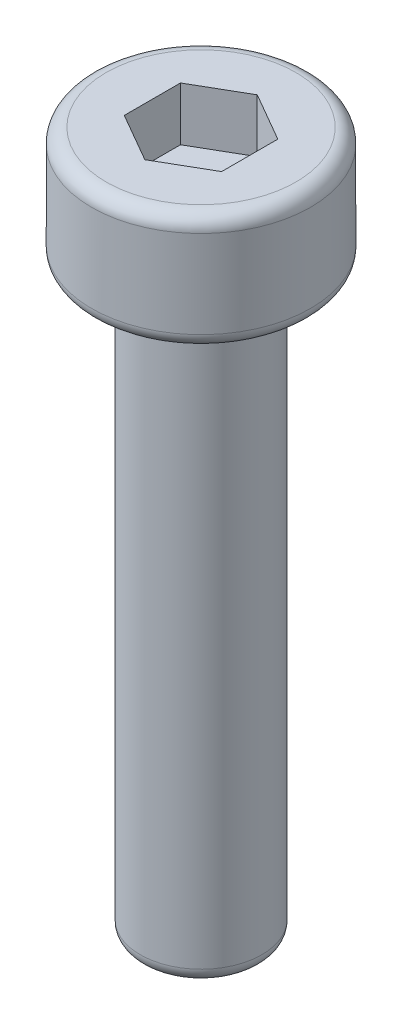
ISO-10303-21;
HEADER;
FILE_DESCRIPTION(('STEP AP214'),'2;1');
FILE_NAME('part.step','',(''),(''),'','','');
FILE_SCHEMA(('AUTOMOTIVE_DESIGN { 1 0 10303 214 1 1 1 1 }'));
ENDSEC;
DATA;
#1=APPLICATION_CONTEXT('core data for automotive mechanical design processes');
#2=APPLICATION_PROTOCOL_DEFINITION('international standard','automotive_design',2000,#1);
#3=PRODUCT_CONTEXT('',#1,'mechanical');
#4=PRODUCT('Part','Part','',(#3));
#5=PRODUCT_RELATED_PRODUCT_CATEGORY('part','',(#4));
#6=PRODUCT_DEFINITION_FORMATION('','',#4);
#7=PRODUCT_DEFINITION_CONTEXT('part definition',#1,'design');
#8=PRODUCT_DEFINITION('design','',#6,#7);
#9=PRODUCT_DEFINITION_SHAPE('','',#8);
#10=(LENGTH_UNIT() NAMED_UNIT(*) SI_UNIT(.MILLI.,.METRE.));
#11=(NAMED_UNIT(*) PLANE_ANGLE_UNIT() SI_UNIT($,.RADIAN.));
#12=(NAMED_UNIT(*) SI_UNIT($,.STERADIAN.) SOLID_ANGLE_UNIT());
#13=UNCERTAINTY_MEASURE_WITH_UNIT(LENGTH_MEASURE(1.E-05),#10,'distance_accuracy_value','');
#14=(GEOMETRIC_REPRESENTATION_CONTEXT(3) GLOBAL_UNCERTAINTY_ASSIGNED_CONTEXT((#13)) GLOBAL_UNIT_ASSIGNED_CONTEXT((#10,
#11,#12)) REPRESENTATION_CONTEXT('',''));
#15=CARTESIAN_POINT('',(0.,0.,0.));
#16=DIRECTION('',(0.,0.,1.));
#17=DIRECTION('',(1.,0.,0.));
#18=AXIS2_PLACEMENT_3D('',#15,#16,#17);
#19=CARTESIAN_POINT('',(0.,0.,0.));
#20=DIRECTION('',(0.,-1.,0.));
#21=DIRECTION('',(1.,0.,0.));
#22=AXIS2_PLACEMENT_3D('',#19,#20,#21);
#23=CYLINDRICAL_SURFACE('',#22,2.25);
#24=CARTESIAN_POINT('',(0.,-0.3,0.));
#25=DIRECTION('',(0.,1.,0.));
#26=DIRECTION('',(-1.,0.,0.));
#27=AXIS2_PLACEMENT_3D('',#24,#25,#26);
#28=CIRCLE('',#27,2.25);
#29=CARTESIAN_POINT('',(-2.25,-0.3,0.));
#30=VERTEX_POINT('',#29);
#31=EDGE_CURVE('E158',#30,#30,#28,.F.);
#32=ORIENTED_EDGE('',*,*,#31,.T.);
#33=EDGE_LOOP('',(#32));
#34=FACE_BOUND('',#33,.T.);
#35=CARTESIAN_POINT('',(0.,-2.1,0.));
#36=DIRECTION('',(0.,-1.,0.));
#37=DIRECTION('',(1.,0.,0.));
#38=AXIS2_PLACEMENT_3D('',#35,#36,#37);
#39=CIRCLE('',#38,2.25);
#40=CARTESIAN_POINT('',(2.25,-2.1,0.));
#41=VERTEX_POINT('',#40);
#42=EDGE_CURVE('E155',#41,#41,#39,.F.);
#43=ORIENTED_EDGE('',*,*,#42,.T.);
#44=EDGE_LOOP('',(#43));
#45=FACE_BOUND('',#44,.T.);
#46=ADVANCED_FACE('F39',(#34,#45),#23,.T.);
#47=CARTESIAN_POINT('',(2.25,0.,0.));
#48=DIRECTION('',(0.,1.,0.));
#49=DIRECTION('',(-1.,0.,0.));
#50=AXIS2_PLACEMENT_3D('',#47,#48,#49);
#51=PLANE('',#50);
#52=CARTESIAN_POINT('',(0.,0.,0.));
#53=DIRECTION('',(0.,1.,0.));
#54=DIRECTION('',(-1.,0.,0.));
#55=AXIS2_PLACEMENT_3D('',#52,#53,#54);
#56=CIRCLE('',#55,1.95);
#57=CARTESIAN_POINT('',(-1.95,0.,0.));
#58=VERTEX_POINT('',#57);
#59=EDGE_CURVE('E47',#58,#58,#56,.T.);
#60=ORIENTED_EDGE('',*,*,#59,.T.);
#61=EDGE_LOOP('',(#60));
#62=FACE_BOUND('',#61,.T.);
#63=DIRECTION('',(-0.866025403784439,0.,-0.5));
#64=VECTOR('',#63,1.);
#65=CARTESIAN_POINT('',(1.,0.,-0.577350269189626));
#66=LINE('',#65,#64);
#67=CARTESIAN_POINT('',(1.,0.,-0.577350269189626));
#68=VERTEX_POINT('',#67);
#69=CARTESIAN_POINT('',(0.,0.,-1.15470053837925));
#70=VERTEX_POINT('',#69);
#71=EDGE_CURVE('E54',#68,#70,#66,.T.);
#72=ORIENTED_EDGE('',*,*,#71,.F.);
#73=DIRECTION('',(0.,0.,-1.));
#74=VECTOR('',#73,1.);
#75=CARTESIAN_POINT('',(1.,0.,0.577350269189626));
#76=LINE('',#75,#74);
#77=CARTESIAN_POINT('',(1.,0.,0.577350269189626));
#78=VERTEX_POINT('',#77);
#79=EDGE_CURVE('E137',#78,#68,#76,.T.);
#80=ORIENTED_EDGE('',*,*,#79,.F.);
#81=DIRECTION('',(0.866025403784439,0.,-0.5));
#82=VECTOR('',#81,1.);
#83=CARTESIAN_POINT('',(0.,0.,1.15470053837925));
#84=LINE('',#83,#82);
#85=CARTESIAN_POINT('',(0.,0.,1.15470053837925));
#86=VERTEX_POINT('',#85);
#87=EDGE_CURVE('E135',#86,#78,#84,.T.);
#88=ORIENTED_EDGE('',*,*,#87,.F.);
#89=DIRECTION('',(0.866025403784439,0.,0.5));
#90=VECTOR('',#89,1.);
#91=CARTESIAN_POINT('',(-1.,0.,0.577350269189627));
#92=LINE('',#91,#90);
#93=CARTESIAN_POINT('',(-1.,0.,0.577350269189627));
#94=VERTEX_POINT('',#93);
#95=EDGE_CURVE('E102',#94,#86,#92,.T.);
#96=ORIENTED_EDGE('',*,*,#95,.F.);
#97=DIRECTION('',(0.,0.,1.));
#98=VECTOR('',#97,1.);
#99=CARTESIAN_POINT('',(-1.,0.,-0.577350269189626));
#100=LINE('',#99,#98);
#101=CARTESIAN_POINT('',(-1.,0.,-0.577350269189626));
#102=VERTEX_POINT('',#101);
#103=EDGE_CURVE('E131',#102,#94,#100,.T.);
#104=ORIENTED_EDGE('',*,*,#103,.F.);
#105=DIRECTION('',(-0.866025403784438,0.,0.5));
#106=VECTOR('',#105,1.);
#107=CARTESIAN_POINT('',(0.,0.,-1.15470053837925));
#108=LINE('',#107,#106);
#109=EDGE_CURVE('E128',#70,#102,#108,.T.);
#110=ORIENTED_EDGE('',*,*,#109,.F.);
#111=EDGE_LOOP('',(#72,#80,#88,#96,#104,#110));
#112=FACE_BOUND('',#111,.T.);
#113=ADVANCED_FACE('F163',(#62,#112),#51,.T.);
#114=CARTESIAN_POINT('',(0.,-2.4,0.));
#115=DIRECTION('',(0.,-1.,0.));
#116=DIRECTION('',(1.,0.,0.));
#117=AXIS2_PLACEMENT_3D('',#114,#115,#116);
#118=PLANE('',#117);
#119=CARTESIAN_POINT('',(0.,-2.4,0.));
#120=DIRECTION('',(0.,-1.,0.));
#121=DIRECTION('',(1.,0.,0.));
#122=AXIS2_PLACEMENT_3D('',#119,#120,#121);
#123=CIRCLE('',#122,1.95);
#124=CARTESIAN_POINT('',(1.95,-2.4,0.));
#125=VERTEX_POINT('',#124);
#126=EDGE_CURVE('E11',#125,#125,#123,.T.);
#127=ORIENTED_EDGE('',*,*,#126,.T.);
#128=EDGE_LOOP('',(#127));
#129=FACE_BOUND('',#128,.T.);
#130=CARTESIAN_POINT('',(0.,-2.4,0.));
#131=DIRECTION('',(0.,-1.,0.));
#132=DIRECTION('',(0.,0.,-1.));
#133=AXIS2_PLACEMENT_3D('',#130,#131,#132);
#134=CIRCLE('',#133,1.25);
#135=CARTESIAN_POINT('',(0.,-2.4,-1.25));
#136=VERTEX_POINT('',#135);
#137=EDGE_CURVE('E141',#136,#136,#134,.T.);
#138=ORIENTED_EDGE('',*,*,#137,.F.);
#139=EDGE_LOOP('',(#138));
#140=FACE_BOUND('',#139,.T.);
#141=ADVANCED_FACE('F181',(#129,#140),#118,.T.);
#142=CARTESIAN_POINT('',(0.,-14.4,0.));
#143=DIRECTION('',(0.,1.,0.));
#144=DIRECTION('',(0.,0.,1.));
#145=AXIS2_PLACEMENT_3D('',#142,#143,#144);
#146=CYLINDRICAL_SURFACE('',#145,1.25);
#147=CARTESIAN_POINT('',(0.,-14.1,0.));
#148=DIRECTION('',(0.,-1.,0.));
#149=DIRECTION('',(0.,0.,-1.));
#150=AXIS2_PLACEMENT_3D('',#147,#148,#149);
#151=CIRCLE('',#150,1.25);
#152=CARTESIAN_POINT('',(0.,-14.1,-1.25));
#153=VERTEX_POINT('',#152);
#154=EDGE_CURVE('E152',#153,#153,#151,.F.);
#155=ORIENTED_EDGE('',*,*,#154,.T.);
#156=EDGE_LOOP('',(#155));
#157=FACE_BOUND('',#156,.T.);
#158=ORIENTED_EDGE('',*,*,#137,.T.);
#159=EDGE_LOOP('',(#158));
#160=FACE_BOUND('',#159,.T.);
#161=ADVANCED_FACE('F184',(#157,#160),#146,.T.);
#162=CARTESIAN_POINT('',(0.,-14.4,0.));
#163=DIRECTION('',(0.,-1.,0.));
#164=DIRECTION('',(0.,0.,-1.));
#165=AXIS2_PLACEMENT_3D('',#162,#163,#164);
#166=PLANE('',#165);
#167=CARTESIAN_POINT('',(0.,-14.4,0.));
#168=DIRECTION('',(0.,-1.,0.));
#169=DIRECTION('',(0.,0.,-1.));
#170=AXIS2_PLACEMENT_3D('',#167,#168,#169);
#171=CIRCLE('',#170,0.95);
#172=CARTESIAN_POINT('',(0.,-14.4,-0.95));
#173=VERTEX_POINT('',#172);
#174=EDGE_CURVE('E149',#173,#173,#171,.T.);
#175=ORIENTED_EDGE('',*,*,#174,.T.);
#176=EDGE_LOOP('',(#175));
#177=FACE_BOUND('',#176,.T.);
#178=ADVANCED_FACE('F189',(#177),#166,.T.);
#179=CARTESIAN_POINT('',(1.,-1.1,-0.577350269189626));
#180=DIRECTION('',(0.5,0.,-0.866025403784439));
#181=DIRECTION('',(-0.866025403784439,0.,-0.5));
#182=AXIS2_PLACEMENT_3D('',#179,#180,#181);
#183=PLANE('',#182);
#184=ORIENTED_EDGE('',*,*,#71,.T.);
#185=DIRECTION('',(0.,1.,0.));
#186=VECTOR('',#185,1.);
#187=CARTESIAN_POINT('',(0.,-1.1,-1.15470053837925));
#188=LINE('',#187,#186);
#189=CARTESIAN_POINT('',(0.,-1.1,-1.15470053837925));
#190=VERTEX_POINT('',#189);
#191=EDGE_CURVE('E84',#190,#70,#188,.T.);
#192=ORIENTED_EDGE('',*,*,#191,.F.);
#193=DIRECTION('',(-0.866025403784439,0.,-0.5));
#194=VECTOR('',#193,1.);
#195=CARTESIAN_POINT('',(1.,-1.1,-0.577350269189626));
#196=LINE('',#195,#194);
#197=CARTESIAN_POINT('',(1.,-1.1,-0.577350269189626));
#198=VERTEX_POINT('',#197);
#199=EDGE_CURVE('E139',#198,#190,#196,.T.);
#200=ORIENTED_EDGE('',*,*,#199,.F.);
#201=DIRECTION('',(0.,1.,0.));
#202=VECTOR('',#201,1.);
#203=CARTESIAN_POINT('',(1.,-1.1,-0.577350269189626));
#204=LINE('',#203,#202);
#205=EDGE_CURVE('E62',#198,#68,#204,.T.);
#206=ORIENTED_EDGE('',*,*,#205,.T.);
#207=EDGE_LOOP('',(#184,#192,#200,#206));
#208=FACE_BOUND('',#207,.T.);
#209=ADVANCED_FACE('F195',(#208),#183,.F.);
#210=CARTESIAN_POINT('',(1.,-1.1,0.577350269189626));
#211=DIRECTION('',(1.,0.,0.));
#212=DIRECTION('',(0.,0.,-1.));
#213=AXIS2_PLACEMENT_3D('',#210,#211,#212);
#214=PLANE('',#213);
#215=ORIENTED_EDGE('',*,*,#79,.T.);
#216=ORIENTED_EDGE('',*,*,#205,.F.);
#217=DIRECTION('',(0.,0.,-1.));
#218=VECTOR('',#217,1.);
#219=CARTESIAN_POINT('',(1.,-1.1,0.577350269189626));
#220=LINE('',#219,#218);
#221=CARTESIAN_POINT('',(1.,-1.1,0.577350269189626));
#222=VERTEX_POINT('',#221);
#223=EDGE_CURVE('E114',#222,#198,#220,.T.);
#224=ORIENTED_EDGE('',*,*,#223,.F.);
#225=DIRECTION('',(0.,1.,0.));
#226=VECTOR('',#225,1.);
#227=CARTESIAN_POINT('',(1.,-1.1,0.577350269189626));
#228=LINE('',#227,#226);
#229=EDGE_CURVE('E106',#222,#78,#228,.T.);
#230=ORIENTED_EDGE('',*,*,#229,.T.);
#231=EDGE_LOOP('',(#215,#216,#224,#230));
#232=FACE_BOUND('',#231,.T.);
#233=ADVANCED_FACE('F219',(#232),#214,.F.);
#234=CARTESIAN_POINT('',(0.,-1.1,1.15470053837925));
#235=DIRECTION('',(0.5,0.,0.866025403784439));
#236=DIRECTION('',(0.866025403784439,0.,-0.5));
#237=AXIS2_PLACEMENT_3D('',#234,#235,#236);
#238=PLANE('',#237);
#239=ORIENTED_EDGE('',*,*,#87,.T.);
#240=ORIENTED_EDGE('',*,*,#229,.F.);
#241=DIRECTION('',(0.866025403784439,0.,-0.5));
#242=VECTOR('',#241,1.);
#243=CARTESIAN_POINT('',(0.,-1.1,1.15470053837925));
#244=LINE('',#243,#242);
#245=CARTESIAN_POINT('',(0.,-1.1,1.15470053837925));
#246=VERTEX_POINT('',#245);
#247=EDGE_CURVE('E110',#246,#222,#244,.T.);
#248=ORIENTED_EDGE('',*,*,#247,.F.);
#249=DIRECTION('',(0.,1.,0.));
#250=VECTOR('',#249,1.);
#251=CARTESIAN_POINT('',(0.,-1.1,1.15470053837925));
#252=LINE('',#251,#250);
#253=EDGE_CURVE('E95',#246,#86,#252,.T.);
#254=ORIENTED_EDGE('',*,*,#253,.T.);
#255=EDGE_LOOP('',(#239,#240,#248,#254));
#256=FACE_BOUND('',#255,.T.);
#257=ADVANCED_FACE('F111',(#256),#238,.F.);
#258=CARTESIAN_POINT('',(-1.,-1.1,0.577350269189627));
#259=DIRECTION('',(-0.5,0.,0.866025403784439));
#260=DIRECTION('',(0.866025403784439,0.,0.5));
#261=AXIS2_PLACEMENT_3D('',#258,#259,#260);
#262=PLANE('',#261);
#263=ORIENTED_EDGE('',*,*,#95,.T.);
#264=ORIENTED_EDGE('',*,*,#253,.F.);
#265=DIRECTION('',(0.866025403784439,0.,0.5));
#266=VECTOR('',#265,1.);
#267=CARTESIAN_POINT('',(-1.,-1.1,0.577350269189627));
#268=LINE('',#267,#266);
#269=CARTESIAN_POINT('',(-1.,-1.1,0.577350269189627));
#270=VERTEX_POINT('',#269);
#271=EDGE_CURVE('E99',#270,#246,#268,.T.);
#272=ORIENTED_EDGE('',*,*,#271,.F.);
#273=DIRECTION('',(0.,1.,0.));
#274=VECTOR('',#273,1.);
#275=CARTESIAN_POINT('',(-1.,-1.1,0.577350269189627));
#276=LINE('',#275,#274);
#277=EDGE_CURVE('E107',#270,#94,#276,.T.);
#278=ORIENTED_EDGE('',*,*,#277,.T.);
#279=EDGE_LOOP('',(#263,#264,#272,#278));
#280=FACE_BOUND('',#279,.T.);
#281=ADVANCED_FACE('F97',(#280),#262,.F.);
#282=CARTESIAN_POINT('',(-1.,-1.1,-0.577350269189626));
#283=DIRECTION('',(-1.,0.,0.));
#284=DIRECTION('',(0.,0.,1.));
#285=AXIS2_PLACEMENT_3D('',#282,#283,#284);
#286=PLANE('',#285);
#287=ORIENTED_EDGE('',*,*,#103,.T.);
#288=ORIENTED_EDGE('',*,*,#277,.F.);
#289=DIRECTION('',(0.,0.,1.));
#290=VECTOR('',#289,1.);
#291=CARTESIAN_POINT('',(-1.,-1.1,-0.577350269189626));
#292=LINE('',#291,#290);
#293=CARTESIAN_POINT('',(-1.,-1.1,-0.577350269189626));
#294=VERTEX_POINT('',#293);
#295=EDGE_CURVE('E120',#294,#270,#292,.T.);
#296=ORIENTED_EDGE('',*,*,#295,.F.);
#297=DIRECTION('',(0.,1.,0.));
#298=VECTOR('',#297,1.);
#299=CARTESIAN_POINT('',(-1.,-1.1,-0.577350269189626));
#300=LINE('',#299,#298);
#301=EDGE_CURVE('E144',#294,#102,#300,.T.);
#302=ORIENTED_EDGE('',*,*,#301,.T.);
#303=EDGE_LOOP('',(#287,#288,#296,#302));
#304=FACE_BOUND('',#303,.T.);
#305=ADVANCED_FACE('F215',(#304),#286,.F.);
#306=CARTESIAN_POINT('',(0.,-1.1,-1.15470053837925));
#307=DIRECTION('',(-0.5,0.,-0.866025403784439));
#308=DIRECTION('',(-0.866025403784439,0.,0.5));
#309=AXIS2_PLACEMENT_3D('',#306,#307,#308);
#310=PLANE('',#309);
#311=ORIENTED_EDGE('',*,*,#109,.T.);
#312=ORIENTED_EDGE('',*,*,#301,.F.);
#313=DIRECTION('',(-0.866025403784438,0.,0.5));
#314=VECTOR('',#313,1.);
#315=CARTESIAN_POINT('',(0.,-1.1,-1.15470053837925));
#316=LINE('',#315,#314);
#317=EDGE_CURVE('E122',#190,#294,#316,.T.);
#318=ORIENTED_EDGE('',*,*,#317,.F.);
#319=ORIENTED_EDGE('',*,*,#191,.T.);
#320=EDGE_LOOP('',(#311,#312,#318,#319));
#321=FACE_BOUND('',#320,.T.);
#322=ADVANCED_FACE('F207',(#321),#310,.F.);
#323=CARTESIAN_POINT('',(0.,-1.1,0.));
#324=DIRECTION('',(0.,1.,0.));
#325=DIRECTION('',(0.,0.,1.));
#326=AXIS2_PLACEMENT_3D('',#323,#324,#325);
#327=PLANE('',#326);
#328=ORIENTED_EDGE('',*,*,#199,.T.);
#329=ORIENTED_EDGE('',*,*,#317,.T.);
#330=ORIENTED_EDGE('',*,*,#295,.T.);
#331=ORIENTED_EDGE('',*,*,#271,.T.);
#332=ORIENTED_EDGE('',*,*,#247,.T.);
#333=ORIENTED_EDGE('',*,*,#223,.T.);
#334=EDGE_LOOP('',(#328,#329,#330,#331,#332,#333));
#335=FACE_BOUND('',#334,.T.);
#336=ADVANCED_FACE('F117',(#335),#327,.T.);
#337=CARTESIAN_POINT('',(0.,-14.1,0.));
#338=DIRECTION('',(0.,-1.,0.));
#339=DIRECTION('',(0.,0.,-1.));
#340=AXIS2_PLACEMENT_3D('',#337,#338,#339);
#341=TOROIDAL_SURFACE('',#340,0.95,0.3);
#342=ORIENTED_EDGE('',*,*,#154,.F.);
#343=EDGE_LOOP('',(#342));
#344=FACE_BOUND('',#343,.T.);
#345=ORIENTED_EDGE('',*,*,#174,.F.);
#346=EDGE_LOOP('',(#345));
#347=FACE_BOUND('',#346,.T.);
#348=ADVANCED_FACE('F169',(#344,#347),#341,.T.);
#349=CARTESIAN_POINT('',(0.,-0.3,0.));
#350=DIRECTION('',(0.,1.,0.));
#351=DIRECTION('',(-1.,0.,0.));
#352=AXIS2_PLACEMENT_3D('',#349,#350,#351);
#353=TOROIDAL_SURFACE('',#352,1.95,0.3);
#354=ORIENTED_EDGE('',*,*,#59,.F.);
#355=EDGE_LOOP('',(#354));
#356=FACE_BOUND('',#355,.T.);
#357=ORIENTED_EDGE('',*,*,#31,.F.);
#358=EDGE_LOOP('',(#357));
#359=FACE_BOUND('',#358,.T.);
#360=ADVANCED_FACE('F166',(#356,#359),#353,.T.);
#361=CARTESIAN_POINT('',(0.,-2.1,0.));
#362=DIRECTION('',(0.,-1.,0.));
#363=DIRECTION('',(1.,0.,0.));
#364=AXIS2_PLACEMENT_3D('',#361,#362,#363);
#365=TOROIDAL_SURFACE('',#364,1.95,0.3);
#366=ORIENTED_EDGE('',*,*,#42,.F.);
#367=EDGE_LOOP('',(#366));
#368=FACE_BOUND('',#367,.T.);
#369=ORIENTED_EDGE('',*,*,#126,.F.);
#370=EDGE_LOOP('',(#369));
#371=FACE_BOUND('',#370,.T.);
#372=ADVANCED_FACE('F41',(#368,#371),#365,.T.);
#373=CLOSED_SHELL('',(#46,#113,#141,#161,#178,#209,#233,#257,#281,#305,#322,#336,#348,#360,#372));
#374=MANIFOLD_SOLID_BREP('B2',#373);
#375=ADVANCED_BREP_SHAPE_REPRESENTATION('',(#18,#374),#14);
#376=SHAPE_DEFINITION_REPRESENTATION(#9,#375);
ENDSEC;
END-ISO-10303-21;
